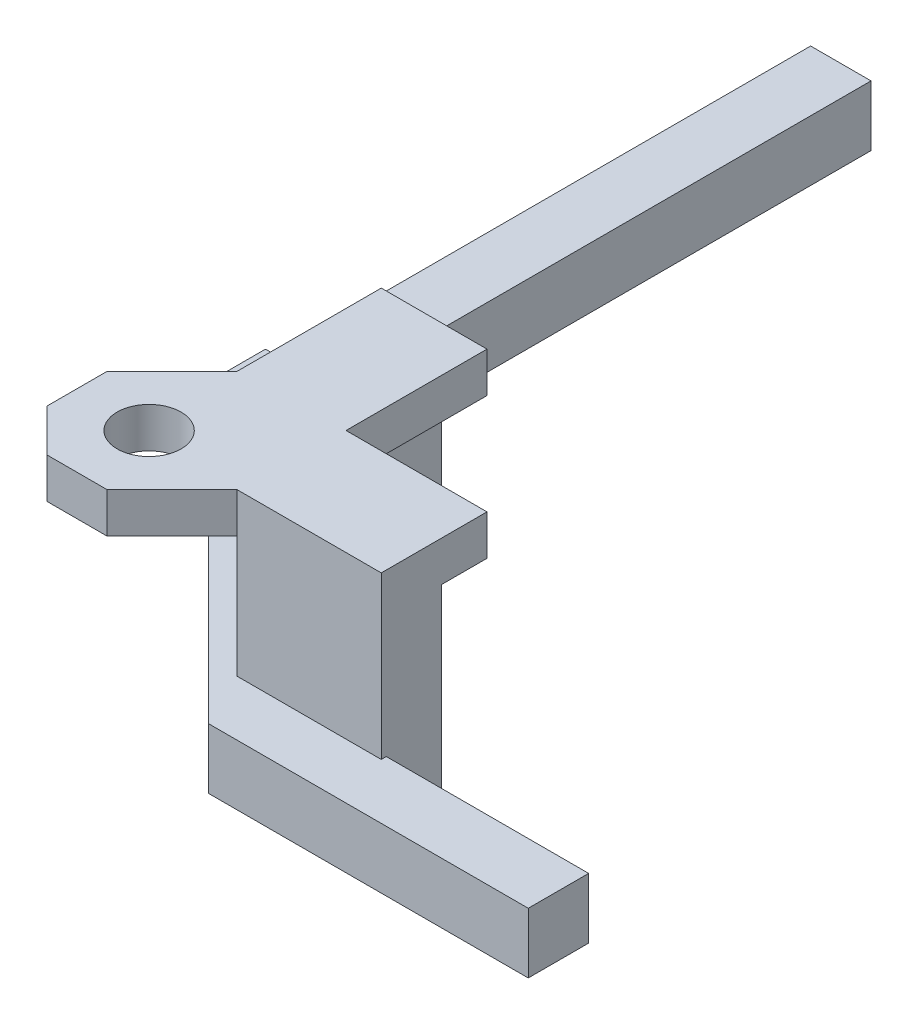
ISO-10303-21;
HEADER;
FILE_DESCRIPTION(('STEP AP214'),'2;1');
FILE_NAME('part.step','',(''),(''),'','','');
FILE_SCHEMA(('AUTOMOTIVE_DESIGN { 1 0 10303 214 1 1 1 1 }'));
ENDSEC;
DATA;
#1=APPLICATION_CONTEXT('core data for automotive mechanical design processes');
#2=APPLICATION_PROTOCOL_DEFINITION('international standard','automotive_design',2000,#1);
#3=PRODUCT_CONTEXT('',#1,'mechanical');
#4=PRODUCT('Part','Part','',(#3));
#5=PRODUCT_RELATED_PRODUCT_CATEGORY('part','',(#4));
#6=PRODUCT_DEFINITION_FORMATION('','',#4);
#7=PRODUCT_DEFINITION_CONTEXT('part definition',#1,'design');
#8=PRODUCT_DEFINITION('design','',#6,#7);
#9=PRODUCT_DEFINITION_SHAPE('','',#8);
#10=(LENGTH_UNIT() NAMED_UNIT(*) SI_UNIT(.MILLI.,.METRE.));
#11=(NAMED_UNIT(*) PLANE_ANGLE_UNIT() SI_UNIT($,.RADIAN.));
#12=(NAMED_UNIT(*) SI_UNIT($,.STERADIAN.) SOLID_ANGLE_UNIT());
#13=UNCERTAINTY_MEASURE_WITH_UNIT(LENGTH_MEASURE(1.E-05),#10,'distance_accuracy_value','');
#14=(GEOMETRIC_REPRESENTATION_CONTEXT(3) GLOBAL_UNCERTAINTY_ASSIGNED_CONTEXT((#13)) GLOBAL_UNIT_ASSIGNED_CONTEXT((#10,
#11,#12)) REPRESENTATION_CONTEXT('',''));
#15=CARTESIAN_POINT('',(0.,0.,0.));
#16=DIRECTION('',(0.,0.,1.));
#17=DIRECTION('',(1.,0.,0.));
#18=AXIS2_PLACEMENT_3D('',#15,#16,#17);
#19=CARTESIAN_POINT('',(-31.9431457505076,6.,76.7));
#20=DIRECTION('',(0.,0.,1.));
#21=DIRECTION('',(1.,0.,0.));
#22=AXIS2_PLACEMENT_3D('',#19,#20,#21);
#23=PLANE('',#22);
#24=DIRECTION('',(-1.,0.,0.));
#25=VECTOR('',#24,1.);
#26=CARTESIAN_POINT('',(13.9652135623731,10.05,76.7));
#27=LINE('',#26,#25);
#28=CARTESIAN_POINT('',(-28.4284271247462,10.05,76.7));
#29=VERTEX_POINT('',#28);
#30=CARTESIAN_POINT('',(-31.9431457505076,10.05,76.7));
#31=VERTEX_POINT('',#30);
#32=EDGE_CURVE('E282',#29,#31,#27,.T.);
#33=ORIENTED_EDGE('',*,*,#32,.F.);
#34=DIRECTION('',(0.,-1.,0.));
#35=VECTOR('',#34,1.);
#36=CARTESIAN_POINT('',(-28.4284271247462,18.05,76.7));
#37=LINE('',#36,#35);
#38=CARTESIAN_POINT('',(-28.4284271247462,18.05,76.7));
#39=VERTEX_POINT('',#38);
#40=EDGE_CURVE('E272',#39,#29,#37,.T.);
#41=ORIENTED_EDGE('',*,*,#40,.F.);
#42=DIRECTION('',(-1.,0.,0.));
#43=VECTOR('',#42,1.);
#44=CARTESIAN_POINT('',(-31.9431457505076,18.05,76.7));
#45=LINE('',#44,#43);
#46=CARTESIAN_POINT('',(-20.1,18.05,76.7));
#47=VERTEX_POINT('',#46);
#48=EDGE_CURVE('E373',#47,#39,#45,.T.);
#49=ORIENTED_EDGE('',*,*,#48,.F.);
#50=DIRECTION('',(0.,-1.,0.));
#51=VECTOR('',#50,1.);
#52=CARTESIAN_POINT('',(-20.1,6.,76.7));
#53=LINE('',#52,#51);
#54=CARTESIAN_POINT('',(-20.1,0.,76.7));
#55=VERTEX_POINT('',#54);
#56=EDGE_CURVE('E489',#47,#55,#53,.T.);
#57=ORIENTED_EDGE('',*,*,#56,.T.);
#58=DIRECTION('',(-1.,0.,0.));
#59=VECTOR('',#58,1.);
#60=CARTESIAN_POINT('',(-31.9431457505076,0.,76.7));
#61=LINE('',#60,#59);
#62=CARTESIAN_POINT('',(-31.9431457505076,0.,76.7));
#63=VERTEX_POINT('',#62);
#64=EDGE_CURVE('E465',#55,#63,#61,.T.);
#65=ORIENTED_EDGE('',*,*,#64,.T.);
#66=DIRECTION('',(0.,-1.,0.));
#67=VECTOR('',#66,1.);
#68=CARTESIAN_POINT('',(-31.9431457505076,6.,76.7));
#69=LINE('',#68,#67);
#70=EDGE_CURVE('E487',#31,#63,#69,.T.);
#71=ORIENTED_EDGE('',*,*,#70,.F.);
#72=EDGE_LOOP('',(#33,#41,#49,#57,#65,#71));
#73=FACE_BOUND('',#72,.T.);
#74=ADVANCED_FACE('F36',(#73),#23,.F.);
#75=CARTESIAN_POINT('',(-38.6,6.,70.0431457505076));
#76=DIRECTION('',(-0.707106781186546,0.,0.707106781186549));
#77=DIRECTION('',(0.707106781186549,0.,0.707106781186546));
#78=AXIS2_PLACEMENT_3D('',#75,#76,#77);
#79=PLANE('',#78);
#80=DIRECTION('',(-0.707106781186549,0.,-0.707106781186546));
#81=VECTOR('',#80,1.);
#82=CARTESIAN_POINT('',(-40.3573593128806,10.05,68.285786437627));
#83=LINE('',#82,#81);
#84=CARTESIAN_POINT('',(-38.6,10.05,70.0431457505076));
#85=VERTEX_POINT('',#84);
#86=EDGE_CURVE('E269',#31,#85,#83,.T.);
#87=ORIENTED_EDGE('',*,*,#86,.F.);
#88=ORIENTED_EDGE('',*,*,#70,.T.);
#89=DIRECTION('',(-0.707106781186548,0.,-0.707106781186546));
#90=VECTOR('',#89,1.);
#91=CARTESIAN_POINT('',(-38.6,0.,70.0431457505076));
#92=LINE('',#91,#90);
#93=CARTESIAN_POINT('',(-38.6,0.,70.0431457505076));
#94=VERTEX_POINT('',#93);
#95=EDGE_CURVE('E468',#63,#94,#92,.T.);
#96=ORIENTED_EDGE('',*,*,#95,.T.);
#97=DIRECTION('',(0.,-1.,0.));
#98=VECTOR('',#97,1.);
#99=CARTESIAN_POINT('',(-38.6,6.,70.0431457505076));
#100=LINE('',#99,#98);
#101=EDGE_CURVE('E485',#85,#94,#100,.T.);
#102=ORIENTED_EDGE('',*,*,#101,.F.);
#103=EDGE_LOOP('',(#87,#88,#96,#102));
#104=FACE_BOUND('',#103,.T.);
#105=ADVANCED_FACE('F609',(#104),#79,.F.);
#106=CARTESIAN_POINT('',(-38.6,6.,58.2));
#107=DIRECTION('',(-1.,0.,0.));
#108=DIRECTION('',(0.,0.,1.));
#109=AXIS2_PLACEMENT_3D('',#106,#107,#108);
#110=PLANE('',#109);
#111=DIRECTION('',(0.,1.,0.));
#112=VECTOR('',#111,1.);
#113=CARTESIAN_POINT('',(-38.6,18.05,66.5284271247462));
#114=LINE('',#113,#112);
#115=CARTESIAN_POINT('',(-38.6,10.05,66.5284271247462));
#116=VERTEX_POINT('',#115);
#117=CARTESIAN_POINT('',(-38.6,18.05,66.5284271247462));
#118=VERTEX_POINT('',#117);
#119=EDGE_CURVE('E61',#116,#118,#114,.T.);
#120=ORIENTED_EDGE('',*,*,#119,.F.);
#121=DIRECTION('',(0.,0.,-1.));
#122=VECTOR('',#121,1.);
#123=CARTESIAN_POINT('',(-38.6,10.05,13.9632135623731));
#124=LINE('',#123,#122);
#125=EDGE_CURVE('E266',#85,#116,#124,.T.);
#126=ORIENTED_EDGE('',*,*,#125,.F.);
#127=ORIENTED_EDGE('',*,*,#101,.T.);
#128=DIRECTION('',(0.,0.,-1.));
#129=VECTOR('',#128,1.);
#130=CARTESIAN_POINT('',(-38.6,0.,58.2));
#131=LINE('',#130,#129);
#132=CARTESIAN_POINT('',(-38.6,0.,58.2));
#133=VERTEX_POINT('',#132);
#134=EDGE_CURVE('E471',#94,#133,#131,.T.);
#135=ORIENTED_EDGE('',*,*,#134,.T.);
#136=DIRECTION('',(0.,-1.,0.));
#137=VECTOR('',#136,1.);
#138=CARTESIAN_POINT('',(-38.6,6.,58.2));
#139=LINE('',#138,#137);
#140=CARTESIAN_POINT('',(-38.6,18.05,58.2));
#141=VERTEX_POINT('',#140);
#142=EDGE_CURVE('E482',#141,#133,#139,.T.);
#143=ORIENTED_EDGE('',*,*,#142,.F.);
#144=DIRECTION('',(0.,0.,-1.));
#145=VECTOR('',#144,1.);
#146=CARTESIAN_POINT('',(-38.6,18.05,58.2));
#147=LINE('',#146,#145);
#148=EDGE_CURVE('E277',#118,#141,#147,.T.);
#149=ORIENTED_EDGE('',*,*,#148,.F.);
#150=EDGE_LOOP('',(#120,#126,#127,#135,#143,#149));
#151=FACE_BOUND('',#150,.T.);
#152=ADVANCED_FACE('F275',(#151),#110,.F.);
#153=CARTESIAN_POINT('',(-44.6,18.05,72.5284271247462));
#154=DIRECTION('',(0.707106781186548,0.,-0.707106781186548));
#155=DIRECTION('',(-0.707106781186548,0.,-0.707106781186548));
#156=AXIS2_PLACEMENT_3D('',#153,#154,#155);
#157=PLANE('',#156);
#158=DIRECTION('',(0.707106781186548,0.,0.707106781186548));
#159=VECTOR('',#158,1.);
#160=CARTESIAN_POINT('',(-44.6,10.05,72.5284271247462));
#161=LINE('',#160,#159);
#162=CARTESIAN_POINT('',(-44.6,10.05,72.5284271247462));
#163=VERTEX_POINT('',#162);
#164=CARTESIAN_POINT('',(-34.4284271247462,10.05,82.7));
#165=VERTEX_POINT('',#164);
#166=EDGE_CURVE('E263',#163,#165,#161,.T.);
#167=ORIENTED_EDGE('',*,*,#166,.F.);
#168=DIRECTION('',(0.,-1.,0.));
#169=VECTOR('',#168,1.);
#170=CARTESIAN_POINT('',(-44.6,18.05,72.5284271247462));
#171=LINE('',#170,#169);
#172=CARTESIAN_POINT('',(-44.6,6.,72.5284271247462));
#173=VERTEX_POINT('',#172);
#174=EDGE_CURVE('E395',#163,#173,#171,.T.);
#175=ORIENTED_EDGE('',*,*,#174,.T.);
#176=DIRECTION('',(0.707106781186548,0.,0.707106781186548));
#177=VECTOR('',#176,1.);
#178=CARTESIAN_POINT('',(-44.6,6.,72.5284271247462));
#179=LINE('',#178,#177);
#180=CARTESIAN_POINT('',(-34.4284271247462,6.,82.7));
#181=VERTEX_POINT('',#180);
#182=EDGE_CURVE('E381',#173,#181,#179,.T.);
#183=ORIENTED_EDGE('',*,*,#182,.T.);
#184=DIRECTION('',(0.,-1.,0.));
#185=VECTOR('',#184,1.);
#186=CARTESIAN_POINT('',(-34.4284271247462,18.05,82.7));
#187=LINE('',#186,#185);
#188=EDGE_CURVE('E391',#165,#181,#187,.T.);
#189=ORIENTED_EDGE('',*,*,#188,.F.);
#190=EDGE_LOOP('',(#167,#175,#183,#189));
#191=FACE_BOUND('',#190,.T.);
#192=ADVANCED_FACE('F657',(#191),#157,.F.);
#193=CARTESIAN_POINT('',(0.,0.,0.));
#194=DIRECTION('',(0.,1.,0.));
#195=DIRECTION('',(0.,0.,1.));
#196=AXIS2_PLACEMENT_3D('',#193,#194,#195);
#197=PLANE('',#196);
#198=DIRECTION('',(-1.,0.,0.));
#199=VECTOR('',#198,1.);
#200=CARTESIAN_POINT('',(-61.15,0.,61.15));
#201=LINE('',#200,#199);
#202=CARTESIAN_POINT('',(-53.15,0.,61.15));
#203=VERTEX_POINT('',#202);
#204=CARTESIAN_POINT('',(-58.8068542494923,0.,61.15));
#205=VERTEX_POINT('',#204);
#206=EDGE_CURVE('E400',#203,#205,#201,.T.);
#207=ORIENTED_EDGE('',*,*,#206,.F.);
#208=DIRECTION('',(0.,0.,1.));
#209=VECTOR('',#208,1.);
#210=CARTESIAN_POINT('',(-53.15,0.,58.2));
#211=LINE('',#210,#209);
#212=CARTESIAN_POINT('',(-53.15,0.,58.2));
#213=VERTEX_POINT('',#212);
#214=EDGE_CURVE('E11',#213,#203,#211,.T.);
#215=ORIENTED_EDGE('',*,*,#214,.F.);
#216=DIRECTION('',(-1.,0.,0.));
#217=VECTOR('',#216,1.);
#218=CARTESIAN_POINT('',(-53.15,0.,58.2));
#219=LINE('',#218,#217);
#220=EDGE_CURVE('E423',#133,#213,#219,.T.);
#221=ORIENTED_EDGE('',*,*,#220,.F.);
#222=ORIENTED_EDGE('',*,*,#134,.F.);
#223=ORIENTED_EDGE('',*,*,#95,.F.);
#224=ORIENTED_EDGE('',*,*,#64,.F.);
#225=DIRECTION('',(0.,0.,-1.));
#226=VECTOR('',#225,1.);
#227=CARTESIAN_POINT('',(-20.1,0.,76.7));
#228=LINE('',#227,#226);
#229=CARTESIAN_POINT('',(-20.1,0.,82.2));
#230=VERTEX_POINT('',#229);
#231=EDGE_CURVE('E463',#230,#55,#228,.T.);
#232=ORIENTED_EDGE('',*,*,#231,.F.);
#233=DIRECTION('',(-1.,0.,0.));
#234=VECTOR('',#233,1.);
#235=CARTESIAN_POINT('',(0.,0.,82.2));
#236=LINE('',#235,#234);
#237=CARTESIAN_POINT('',(0.,0.,82.2));
#238=VERTEX_POINT('',#237);
#239=EDGE_CURVE('E461',#238,#230,#236,.T.);
#240=ORIENTED_EDGE('',*,*,#239,.F.);
#241=DIRECTION('',(0.,0.,-1.));
#242=VECTOR('',#241,1.);
#243=CARTESIAN_POINT('',(0.,0.,88.2));
#244=LINE('',#243,#242);
#245=CARTESIAN_POINT('',(0.,0.,88.2));
#246=VERTEX_POINT('',#245);
#247=EDGE_CURVE('E459',#246,#238,#244,.T.);
#248=ORIENTED_EDGE('',*,*,#247,.F.);
#249=DIRECTION('',(1.,0.,0.));
#250=VECTOR('',#249,1.);
#251=CARTESIAN_POINT('',(-31.7568542494924,0.,88.2));
#252=LINE('',#251,#250);
#253=CARTESIAN_POINT('',(-31.7568542494924,0.,88.2));
#254=VERTEX_POINT('',#253);
#255=EDGE_CURVE('E457',#254,#246,#252,.T.);
#256=ORIENTED_EDGE('',*,*,#255,.F.);
#257=DIRECTION('',(0.707106781186546,0.,0.707106781186549));
#258=VECTOR('',#257,1.);
#259=CARTESIAN_POINT('',(-58.8068542494923,0.,61.15));
#260=LINE('',#259,#258);
#261=EDGE_CURVE('E455',#205,#254,#260,.T.);
#262=ORIENTED_EDGE('',*,*,#261,.F.);
#263=EDGE_LOOP('',(#207,#215,#221,#222,#223,#224,#232,#240,#248,#256,#262));
#264=FACE_BOUND('',#263,.T.);
#265=ADVANCED_FACE('F619',(#264),#197,.F.);
#266=DIRECTION('',(1.,0.,0.));
#267=VECTOR('',#266,1.);
#268=CARTESIAN_POINT('',(-61.15,0.,53.15));
#269=LINE('',#268,#267);
#270=CARTESIAN_POINT('',(-60.15,0.,53.15));
#271=VERTEX_POINT('',#270);
#272=CARTESIAN_POINT('',(-54.15,0.,53.15));
#273=VERTEX_POINT('',#272);
#274=EDGE_CURVE('E45',#271,#273,#269,.T.);
#275=ORIENTED_EDGE('',*,*,#274,.F.);
#276=DIRECTION('',(0.,0.,1.));
#277=VECTOR('',#276,1.);
#278=CARTESIAN_POINT('',(-60.15,0.,0.));
#279=LINE('',#278,#277);
#280=CARTESIAN_POINT('',(-60.15,0.,0.));
#281=VERTEX_POINT('',#280);
#282=EDGE_CURVE('E452',#281,#271,#279,.T.);
#283=ORIENTED_EDGE('',*,*,#282,.F.);
#284=DIRECTION('',(-1.,0.,0.));
#285=VECTOR('',#284,1.);
#286=CARTESIAN_POINT('',(-54.15,0.,0.));
#287=LINE('',#286,#285);
#288=CARTESIAN_POINT('',(-54.15,0.,0.));
#289=VERTEX_POINT('',#288);
#290=EDGE_CURVE('E450',#289,#281,#287,.T.);
#291=ORIENTED_EDGE('',*,*,#290,.F.);
#292=DIRECTION('',(0.,0.,-1.));
#293=VECTOR('',#292,1.);
#294=CARTESIAN_POINT('',(-54.15,0.,0.));
#295=LINE('',#294,#293);
#296=EDGE_CURVE('E418',#273,#289,#295,.T.);
#297=ORIENTED_EDGE('',*,*,#296,.F.);
#298=EDGE_LOOP('',(#275,#283,#291,#297));
#299=FACE_BOUND('',#298,.T.);
#300=ADVANCED_FACE('F528',(#299),#197,.F.);
#301=CARTESIAN_POINT('',(-54.15,6.,0.));
#302=DIRECTION('',(-1.,0.,0.));
#303=DIRECTION('',(0.,0.,1.));
#304=AXIS2_PLACEMENT_3D('',#301,#302,#303);
#305=PLANE('',#304);
#306=ORIENTED_EDGE('',*,*,#296,.T.);
#307=DIRECTION('',(0.,-1.,0.));
#308=VECTOR('',#307,1.);
#309=CARTESIAN_POINT('',(-54.15,6.,0.));
#310=LINE('',#309,#308);
#311=CARTESIAN_POINT('',(-54.15,6.,0.));
#312=VERTEX_POINT('',#311);
#313=EDGE_CURVE('E40',#312,#289,#310,.T.);
#314=ORIENTED_EDGE('',*,*,#313,.F.);
#315=DIRECTION('',(0.,0.,-1.));
#316=VECTOR('',#315,1.);
#317=CARTESIAN_POINT('',(-54.15,6.,0.));
#318=LINE('',#317,#316);
#319=CARTESIAN_POINT('',(-54.15,6.,53.15));
#320=VERTEX_POINT('',#319);
#321=EDGE_CURVE('E419',#320,#312,#318,.T.);
#322=ORIENTED_EDGE('',*,*,#321,.F.);
#323=DIRECTION('',(0.,-1.,0.));
#324=VECTOR('',#323,1.);
#325=CARTESIAN_POINT('',(-54.15,6.,53.15));
#326=LINE('',#325,#324);
#327=EDGE_CURVE('E447',#320,#273,#326,.T.);
#328=ORIENTED_EDGE('',*,*,#327,.T.);
#329=EDGE_LOOP('',(#306,#314,#322,#328));
#330=FACE_BOUND('',#329,.T.);
#331=ADVANCED_FACE('F38',(#330),#305,.F.);
#332=CARTESIAN_POINT('',(-54.15,6.,0.));
#333=DIRECTION('',(0.,0.,1.));
#334=DIRECTION('',(1.,0.,0.));
#335=AXIS2_PLACEMENT_3D('',#332,#333,#334);
#336=PLANE('',#335);
#337=ORIENTED_EDGE('',*,*,#290,.T.);
#338=DIRECTION('',(0.,-1.,0.));
#339=VECTOR('',#338,1.);
#340=CARTESIAN_POINT('',(-60.15,6.,0.));
#341=LINE('',#340,#339);
#342=CARTESIAN_POINT('',(-60.15,6.,0.));
#343=VERTEX_POINT('',#342);
#344=EDGE_CURVE('E513',#343,#281,#341,.T.);
#345=ORIENTED_EDGE('',*,*,#344,.F.);
#346=DIRECTION('',(-1.,0.,0.));
#347=VECTOR('',#346,1.);
#348=CARTESIAN_POINT('',(-54.15,6.,0.));
#349=LINE('',#348,#347);
#350=EDGE_CURVE('E422',#312,#343,#349,.T.);
#351=ORIENTED_EDGE('',*,*,#350,.F.);
#352=ORIENTED_EDGE('',*,*,#313,.T.);
#353=EDGE_LOOP('',(#337,#345,#351,#352));
#354=FACE_BOUND('',#353,.T.);
#355=ADVANCED_FACE('F522',(#354),#336,.F.);
#356=CARTESIAN_POINT('',(-60.15,6.,0.));
#357=DIRECTION('',(1.,0.,0.));
#358=DIRECTION('',(0.,0.,-1.));
#359=AXIS2_PLACEMENT_3D('',#356,#357,#358);
#360=PLANE('',#359);
#361=ORIENTED_EDGE('',*,*,#282,.T.);
#362=DIRECTION('',(0.,-1.,0.));
#363=VECTOR('',#362,1.);
#364=CARTESIAN_POINT('',(-60.15,6.,53.15));
#365=LINE('',#364,#363);
#366=CARTESIAN_POINT('',(-60.15,6.,53.15));
#367=VERTEX_POINT('',#366);
#368=EDGE_CURVE('E511',#367,#271,#365,.T.);
#369=ORIENTED_EDGE('',*,*,#368,.F.);
#370=DIRECTION('',(0.,0.,1.));
#371=VECTOR('',#370,1.);
#372=CARTESIAN_POINT('',(-60.15,6.,0.));
#373=LINE('',#372,#371);
#374=EDGE_CURVE('E425',#343,#367,#373,.T.);
#375=ORIENTED_EDGE('',*,*,#374,.F.);
#376=ORIENTED_EDGE('',*,*,#344,.T.);
#377=EDGE_LOOP('',(#361,#369,#375,#376));
#378=FACE_BOUND('',#377,.T.);
#379=ADVANCED_FACE('F530',(#378),#360,.F.);
#380=CARTESIAN_POINT('',(-61.15,6.,53.15));
#381=DIRECTION('',(1.,0.,0.));
#382=DIRECTION('',(0.,0.,-1.));
#383=AXIS2_PLACEMENT_3D('',#380,#381,#382);
#384=PLANE('',#383);
#385=DIRECTION('',(0.,-1.,0.));
#386=VECTOR('',#385,1.);
#387=CARTESIAN_POINT('',(-61.15,6.,53.15));
#388=LINE('',#387,#386);
#389=CARTESIAN_POINT('',(-61.15,6.,53.15));
#390=VERTEX_POINT('',#389);
#391=CARTESIAN_POINT('',(-61.15,-1.,53.15));
#392=VERTEX_POINT('',#391);
#393=EDGE_CURVE('E509',#390,#392,#388,.T.);
#394=ORIENTED_EDGE('',*,*,#393,.T.);
#395=DIRECTION('',(0.,0.,-1.));
#396=VECTOR('',#395,1.);
#397=CARTESIAN_POINT('',(-61.15,-1.,53.15));
#398=LINE('',#397,#396);
#399=CARTESIAN_POINT('',(-61.15,-1.,61.15));
#400=VERTEX_POINT('',#399);
#401=EDGE_CURVE('E407',#400,#392,#398,.T.);
#402=ORIENTED_EDGE('',*,*,#401,.F.);
#403=DIRECTION('',(0.,-1.,0.));
#404=VECTOR('',#403,1.);
#405=CARTESIAN_POINT('',(-61.15,6.,61.15));
#406=LINE('',#405,#404);
#407=CARTESIAN_POINT('',(-61.15,6.,61.15));
#408=VERTEX_POINT('',#407);
#409=EDGE_CURVE('E507',#408,#400,#406,.T.);
#410=ORIENTED_EDGE('',*,*,#409,.F.);
#411=DIRECTION('',(0.,0.,1.));
#412=VECTOR('',#411,1.);
#413=CARTESIAN_POINT('',(-61.15,6.,53.15));
#414=LINE('',#413,#412);
#415=EDGE_CURVE('E429',#390,#408,#414,.T.);
#416=ORIENTED_EDGE('',*,*,#415,.F.);
#417=EDGE_LOOP('',(#394,#402,#410,#416));
#418=FACE_BOUND('',#417,.T.);
#419=ADVANCED_FACE('F551',(#418),#384,.F.);
#420=CARTESIAN_POINT('',(-61.15,6.,61.15));
#421=DIRECTION('',(0.,0.,-1.));
#422=DIRECTION('',(-1.,0.,0.));
#423=AXIS2_PLACEMENT_3D('',#420,#421,#422);
#424=PLANE('',#423);
#425=ORIENTED_EDGE('',*,*,#409,.T.);
#426=DIRECTION('',(-1.,0.,0.));
#427=VECTOR('',#426,1.);
#428=CARTESIAN_POINT('',(-61.15,-1.,61.15));
#429=LINE('',#428,#427);
#430=CARTESIAN_POINT('',(-53.15,-1.,61.15));
#431=VERTEX_POINT('',#430);
#432=EDGE_CURVE('E404',#431,#400,#429,.T.);
#433=ORIENTED_EDGE('',*,*,#432,.F.);
#434=DIRECTION('',(0.,1.,0.));
#435=VECTOR('',#434,1.);
#436=CARTESIAN_POINT('',(-53.15,-1.,61.15));
#437=LINE('',#436,#435);
#438=EDGE_CURVE('E413',#431,#203,#437,.T.);
#439=ORIENTED_EDGE('',*,*,#438,.T.);
#440=ORIENTED_EDGE('',*,*,#206,.T.);
#441=DIRECTION('',(0.,-1.,0.));
#442=VECTOR('',#441,1.);
#443=CARTESIAN_POINT('',(-58.8068542494923,6.,61.15));
#444=LINE('',#443,#442);
#445=CARTESIAN_POINT('',(-58.8068542494923,6.,61.15));
#446=VERTEX_POINT('',#445);
#447=EDGE_CURVE('E504',#446,#205,#444,.T.);
#448=ORIENTED_EDGE('',*,*,#447,.F.);
#449=DIRECTION('',(1.,0.,0.));
#450=VECTOR('',#449,1.);
#451=CARTESIAN_POINT('',(-61.15,6.,61.15));
#452=LINE('',#451,#450);
#453=EDGE_CURVE('E431',#408,#446,#452,.T.);
#454=ORIENTED_EDGE('',*,*,#453,.F.);
#455=EDGE_LOOP('',(#425,#433,#439,#440,#448,#454));
#456=FACE_BOUND('',#455,.T.);
#457=ADVANCED_FACE('F555',(#456),#424,.F.);
#458=CARTESIAN_POINT('',(-58.8068542494923,6.,61.15));
#459=DIRECTION('',(0.707106781186548,0.,-0.707106781186546));
#460=DIRECTION('',(-0.707106781186546,0.,-0.707106781186549));
#461=AXIS2_PLACEMENT_3D('',#458,#459,#460);
#462=PLANE('',#461);
#463=ORIENTED_EDGE('',*,*,#261,.T.);
#464=DIRECTION('',(0.,-1.,0.));
#465=VECTOR('',#464,1.);
#466=CARTESIAN_POINT('',(-31.7568542494924,6.,88.2));
#467=LINE('',#466,#465);
#468=CARTESIAN_POINT('',(-31.7568542494924,6.,88.2));
#469=VERTEX_POINT('',#468);
#470=EDGE_CURVE('E501',#469,#254,#467,.T.);
#471=ORIENTED_EDGE('',*,*,#470,.F.);
#472=DIRECTION('',(0.707106781186546,0.,0.707106781186549));
#473=VECTOR('',#472,1.);
#474=CARTESIAN_POINT('',(-58.8068542494923,6.,61.15));
#475=LINE('',#474,#473);
#476=EDGE_CURVE('E433',#446,#469,#475,.T.);
#477=ORIENTED_EDGE('',*,*,#476,.F.);
#478=ORIENTED_EDGE('',*,*,#447,.T.);
#479=EDGE_LOOP('',(#463,#471,#477,#478));
#480=FACE_BOUND('',#479,.T.);
#481=ADVANCED_FACE('F561',(#480),#462,.F.);
#482=CARTESIAN_POINT('',(-31.7568542494924,6.,88.2));
#483=DIRECTION('',(0.,0.,-1.));
#484=DIRECTION('',(-1.,0.,0.));
#485=AXIS2_PLACEMENT_3D('',#482,#483,#484);
#486=PLANE('',#485);
#487=ORIENTED_EDGE('',*,*,#255,.T.);
#488=DIRECTION('',(0.,-1.,0.));
#489=VECTOR('',#488,1.);
#490=CARTESIAN_POINT('',(0.,6.,88.2));
#491=LINE('',#490,#489);
#492=CARTESIAN_POINT('',(0.,6.,88.2));
#493=VERTEX_POINT('',#492);
#494=EDGE_CURVE('E498',#493,#246,#491,.T.);
#495=ORIENTED_EDGE('',*,*,#494,.F.);
#496=DIRECTION('',(1.,0.,0.));
#497=VECTOR('',#496,1.);
#498=CARTESIAN_POINT('',(-31.7568542494924,6.,88.2));
#499=LINE('',#498,#497);
#500=EDGE_CURVE('E435',#469,#493,#499,.T.);
#501=ORIENTED_EDGE('',*,*,#500,.F.);
#502=ORIENTED_EDGE('',*,*,#470,.T.);
#503=EDGE_LOOP('',(#487,#495,#501,#502));
#504=FACE_BOUND('',#503,.T.);
#505=ADVANCED_FACE('F565',(#504),#486,.F.);
#506=CARTESIAN_POINT('',(0.,6.,88.2));
#507=DIRECTION('',(-1.,0.,0.));
#508=DIRECTION('',(0.,0.,1.));
#509=AXIS2_PLACEMENT_3D('',#506,#507,#508);
#510=PLANE('',#509);
#511=ORIENTED_EDGE('',*,*,#247,.T.);
#512=DIRECTION('',(0.,-1.,0.));
#513=VECTOR('',#512,1.);
#514=CARTESIAN_POINT('',(0.,6.,82.2));
#515=LINE('',#514,#513);
#516=CARTESIAN_POINT('',(0.,6.,82.2));
#517=VERTEX_POINT('',#516);
#518=EDGE_CURVE('E495',#517,#238,#515,.T.);
#519=ORIENTED_EDGE('',*,*,#518,.F.);
#520=DIRECTION('',(0.,0.,-1.));
#521=VECTOR('',#520,1.);
#522=CARTESIAN_POINT('',(0.,6.,88.2));
#523=LINE('',#522,#521);
#524=EDGE_CURVE('E437',#493,#517,#523,.T.);
#525=ORIENTED_EDGE('',*,*,#524,.F.);
#526=ORIENTED_EDGE('',*,*,#494,.T.);
#527=EDGE_LOOP('',(#511,#519,#525,#526));
#528=FACE_BOUND('',#527,.T.);
#529=ADVANCED_FACE('F570',(#528),#510,.F.);
#530=CARTESIAN_POINT('',(0.,6.,82.2));
#531=DIRECTION('',(0.,0.,1.));
#532=DIRECTION('',(1.,0.,0.));
#533=AXIS2_PLACEMENT_3D('',#530,#531,#532);
#534=PLANE('',#533);
#535=ORIENTED_EDGE('',*,*,#239,.T.);
#536=DIRECTION('',(0.,-1.,0.));
#537=VECTOR('',#536,1.);
#538=CARTESIAN_POINT('',(-20.1,6.,82.2));
#539=LINE('',#538,#537);
#540=CARTESIAN_POINT('',(-20.1,6.,82.2));
#541=VERTEX_POINT('',#540);
#542=EDGE_CURVE('E492',#541,#230,#539,.T.);
#543=ORIENTED_EDGE('',*,*,#542,.F.);
#544=DIRECTION('',(-1.,0.,0.));
#545=VECTOR('',#544,1.);
#546=CARTESIAN_POINT('',(0.,6.,82.2));
#547=LINE('',#546,#545);
#548=EDGE_CURVE('E439',#517,#541,#547,.T.);
#549=ORIENTED_EDGE('',*,*,#548,.F.);
#550=ORIENTED_EDGE('',*,*,#518,.T.);
#551=EDGE_LOOP('',(#535,#543,#549,#550));
#552=FACE_BOUND('',#551,.T.);
#553=ADVANCED_FACE('F575',(#552),#534,.F.);
#554=CARTESIAN_POINT('',(-20.1,6.,76.7));
#555=DIRECTION('',(-1.,0.,0.));
#556=DIRECTION('',(0.,0.,1.));
#557=AXIS2_PLACEMENT_3D('',#554,#555,#556);
#558=PLANE('',#557);
#559=ORIENTED_EDGE('',*,*,#231,.T.);
#560=ORIENTED_EDGE('',*,*,#56,.F.);
#561=DIRECTION('',(0.,0.,-1.));
#562=VECTOR('',#561,1.);
#563=CARTESIAN_POINT('',(-20.1,18.05,72.2));
#564=LINE('',#563,#562);
#565=CARTESIAN_POINT('',(-20.1,18.05,72.2));
#566=VERTEX_POINT('',#565);
#567=EDGE_CURVE('E338',#47,#566,#564,.T.);
#568=ORIENTED_EDGE('',*,*,#567,.T.);
#569=DIRECTION('',(0.,-1.,0.));
#570=VECTOR('',#569,1.);
#571=CARTESIAN_POINT('',(-20.1,22.05,72.2));
#572=LINE('',#571,#570);
#573=CARTESIAN_POINT('',(-20.1,22.05,72.2));
#574=VERTEX_POINT('',#573);
#575=EDGE_CURVE('E351',#574,#566,#572,.T.);
#576=ORIENTED_EDGE('',*,*,#575,.F.);
#577=DIRECTION('',(0.,0.,-1.));
#578=VECTOR('',#577,1.);
#579=CARTESIAN_POINT('',(-20.1,22.05,72.2));
#580=LINE('',#579,#578);
#581=CARTESIAN_POINT('',(-20.1,22.05,82.7));
#582=VERTEX_POINT('',#581);
#583=EDGE_CURVE('E314',#582,#574,#580,.T.);
#584=ORIENTED_EDGE('',*,*,#583,.F.);
#585=DIRECTION('',(0.,-1.,0.));
#586=VECTOR('',#585,1.);
#587=CARTESIAN_POINT('',(-20.1,18.05,82.7));
#588=LINE('',#587,#586);
#589=CARTESIAN_POINT('',(-20.1,6.,82.7));
#590=VERTEX_POINT('',#589);
#591=EDGE_CURVE('E378',#582,#590,#588,.T.);
#592=ORIENTED_EDGE('',*,*,#591,.T.);
#593=DIRECTION('',(0.,0.,-1.));
#594=VECTOR('',#593,1.);
#595=CARTESIAN_POINT('',(-20.1,6.,82.7));
#596=LINE('',#595,#594);
#597=EDGE_CURVE('E376',#590,#541,#596,.T.);
#598=ORIENTED_EDGE('',*,*,#597,.T.);
#599=ORIENTED_EDGE('',*,*,#542,.T.);
#600=EDGE_LOOP('',(#559,#560,#568,#576,#584,#592,#598,#599));
#601=FACE_BOUND('',#600,.T.);
#602=ADVANCED_FACE('F579',(#601),#558,.F.);
#603=CARTESIAN_POINT('',(-53.15,6.,58.2));
#604=DIRECTION('',(0.,0.,1.));
#605=DIRECTION('',(1.,0.,0.));
#606=AXIS2_PLACEMENT_3D('',#603,#604,#605);
#607=PLANE('',#606);
#608=ORIENTED_EDGE('',*,*,#220,.T.);
#609=DIRECTION('',(0.,-1.,0.));
#610=VECTOR('',#609,1.);
#611=CARTESIAN_POINT('',(-53.15,6.,58.2));
#612=LINE('',#611,#610);
#613=CARTESIAN_POINT('',(-53.15,6.,58.2));
#614=VERTEX_POINT('',#613);
#615=EDGE_CURVE('E479',#614,#213,#612,.T.);
#616=ORIENTED_EDGE('',*,*,#615,.F.);
#617=DIRECTION('',(-1.,0.,0.));
#618=VECTOR('',#617,1.);
#619=CARTESIAN_POINT('',(-53.15,6.,58.2));
#620=LINE('',#619,#618);
#621=CARTESIAN_POINT('',(-44.6,6.,58.2));
#622=VERTEX_POINT('',#621);
#623=EDGE_CURVE('E441',#622,#614,#620,.T.);
#624=ORIENTED_EDGE('',*,*,#623,.F.);
#625=DIRECTION('',(0.,-1.,0.));
#626=VECTOR('',#625,1.);
#627=CARTESIAN_POINT('',(-44.6,18.05,58.2));
#628=LINE('',#627,#626);
#629=CARTESIAN_POINT('',(-44.6,22.05,58.2));
#630=VERTEX_POINT('',#629);
#631=EDGE_CURVE('E397',#630,#622,#628,.T.);
#632=ORIENTED_EDGE('',*,*,#631,.F.);
#633=DIRECTION('',(-1.,0.,0.));
#634=VECTOR('',#633,1.);
#635=CARTESIAN_POINT('',(-44.6,22.05,58.2));
#636=LINE('',#635,#634);
#637=CARTESIAN_POINT('',(-34.1,22.05,58.2));
#638=VERTEX_POINT('',#637);
#639=EDGE_CURVE('E320',#638,#630,#636,.T.);
#640=ORIENTED_EDGE('',*,*,#639,.F.);
#641=DIRECTION('',(0.,-1.,0.));
#642=VECTOR('',#641,1.);
#643=CARTESIAN_POINT('',(-34.1,22.05,58.2));
#644=LINE('',#643,#642);
#645=CARTESIAN_POINT('',(-34.1,18.05,58.2));
#646=VERTEX_POINT('',#645);
#647=EDGE_CURVE('E323',#638,#646,#644,.T.);
#648=ORIENTED_EDGE('',*,*,#647,.T.);
#649=DIRECTION('',(-1.,0.,0.));
#650=VECTOR('',#649,1.);
#651=CARTESIAN_POINT('',(-44.6,18.05,58.2));
#652=LINE('',#651,#650);
#653=EDGE_CURVE('E301',#646,#141,#652,.T.);
#654=ORIENTED_EDGE('',*,*,#653,.T.);
#655=ORIENTED_EDGE('',*,*,#142,.T.);
#656=EDGE_LOOP('',(#608,#616,#624,#632,#640,#648,#654,#655));
#657=FACE_BOUND('',#656,.T.);
#658=ADVANCED_FACE('F615',(#657),#607,.F.);
#659=CARTESIAN_POINT('',(-53.15,6.,53.1499999999999));
#660=DIRECTION('',(-1.,0.,0.));
#661=DIRECTION('',(0.,0.,1.));
#662=AXIS2_PLACEMENT_3D('',#659,#660,#661);
#663=PLANE('',#662);
#664=ORIENTED_EDGE('',*,*,#615,.T.);
#665=ORIENTED_EDGE('',*,*,#214,.T.);
#666=ORIENTED_EDGE('',*,*,#438,.F.);
#667=DIRECTION('',(0.,0.,1.));
#668=VECTOR('',#667,1.);
#669=CARTESIAN_POINT('',(-53.15,-1.,61.15));
#670=LINE('',#669,#668);
#671=CARTESIAN_POINT('',(-53.15,-1.,53.1499999999999));
#672=VERTEX_POINT('',#671);
#673=EDGE_CURVE('E401',#672,#431,#670,.T.);
#674=ORIENTED_EDGE('',*,*,#673,.F.);
#675=DIRECTION('',(0.,-1.,0.));
#676=VECTOR('',#675,1.);
#677=CARTESIAN_POINT('',(-53.15,6.,53.1499999999999));
#678=LINE('',#677,#676);
#679=CARTESIAN_POINT('',(-53.15,6.,53.1499999999999));
#680=VERTEX_POINT('',#679);
#681=EDGE_CURVE('E477',#680,#672,#678,.T.);
#682=ORIENTED_EDGE('',*,*,#681,.F.);
#683=DIRECTION('',(0.,0.,-1.));
#684=VECTOR('',#683,1.);
#685=CARTESIAN_POINT('',(-53.15,6.,53.1499999999999));
#686=LINE('',#685,#684);
#687=EDGE_CURVE('E443',#614,#680,#686,.T.);
#688=ORIENTED_EDGE('',*,*,#687,.F.);
#689=EDGE_LOOP('',(#664,#665,#666,#674,#682,#688));
#690=FACE_BOUND('',#689,.T.);
#691=ADVANCED_FACE('F546',(#690),#663,.F.);
#692=CARTESIAN_POINT('',(-54.15,6.,53.15));
#693=DIRECTION('',(0.,0.,1.));
#694=DIRECTION('',(1.,0.,0.));
#695=AXIS2_PLACEMENT_3D('',#692,#693,#694);
#696=PLANE('',#695);
#697=ORIENTED_EDGE('',*,*,#681,.T.);
#698=DIRECTION('',(1.,0.,0.));
#699=VECTOR('',#698,1.);
#700=CARTESIAN_POINT('',(-61.15,-1.,53.15));
#701=LINE('',#700,#699);
#702=EDGE_CURVE('E410',#392,#672,#701,.T.);
#703=ORIENTED_EDGE('',*,*,#702,.F.);
#704=ORIENTED_EDGE('',*,*,#393,.F.);
#705=DIRECTION('',(-1.,0.,0.));
#706=VECTOR('',#705,1.);
#707=CARTESIAN_POINT('',(-60.15,6.,53.15));
#708=LINE('',#707,#706);
#709=EDGE_CURVE('E427',#367,#390,#708,.T.);
#710=ORIENTED_EDGE('',*,*,#709,.F.);
#711=ORIENTED_EDGE('',*,*,#368,.T.);
#712=ORIENTED_EDGE('',*,*,#274,.T.);
#713=ORIENTED_EDGE('',*,*,#327,.F.);
#714=DIRECTION('',(-1.,0.,0.));
#715=VECTOR('',#714,1.);
#716=CARTESIAN_POINT('',(-54.15,6.,53.15));
#717=LINE('',#716,#715);
#718=EDGE_CURVE('E445',#680,#320,#717,.T.);
#719=ORIENTED_EDGE('',*,*,#718,.F.);
#720=EDGE_LOOP('',(#697,#703,#704,#710,#711,#712,#713,#719));
#721=FACE_BOUND('',#720,.T.);
#722=ADVANCED_FACE('F533',(#721),#696,.F.);
#723=CARTESIAN_POINT('',(0.,6.,0.));
#724=DIRECTION('',(0.,1.,0.));
#725=DIRECTION('',(0.,0.,1.));
#726=AXIS2_PLACEMENT_3D('',#723,#724,#725);
#727=PLANE('',#726);
#728=ORIENTED_EDGE('',*,*,#597,.F.);
#729=DIRECTION('',(1.,0.,0.));
#730=VECTOR('',#729,1.);
#731=CARTESIAN_POINT('',(-34.4284271247462,6.,82.7));
#732=LINE('',#731,#730);
#733=EDGE_CURVE('E384',#181,#590,#732,.T.);
#734=ORIENTED_EDGE('',*,*,#733,.F.);
#735=ORIENTED_EDGE('',*,*,#182,.F.);
#736=DIRECTION('',(0.,0.,1.));
#737=VECTOR('',#736,1.);
#738=CARTESIAN_POINT('',(-44.6,6.,58.2));
#739=LINE('',#738,#737);
#740=EDGE_CURVE('E372',#622,#173,#739,.T.);
#741=ORIENTED_EDGE('',*,*,#740,.F.);
#742=ORIENTED_EDGE('',*,*,#623,.T.);
#743=ORIENTED_EDGE('',*,*,#687,.T.);
#744=ORIENTED_EDGE('',*,*,#718,.T.);
#745=ORIENTED_EDGE('',*,*,#321,.T.);
#746=ORIENTED_EDGE('',*,*,#350,.T.);
#747=ORIENTED_EDGE('',*,*,#374,.T.);
#748=ORIENTED_EDGE('',*,*,#709,.T.);
#749=ORIENTED_EDGE('',*,*,#415,.T.);
#750=ORIENTED_EDGE('',*,*,#453,.T.);
#751=ORIENTED_EDGE('',*,*,#476,.T.);
#752=ORIENTED_EDGE('',*,*,#500,.T.);
#753=ORIENTED_EDGE('',*,*,#524,.T.);
#754=ORIENTED_EDGE('',*,*,#548,.T.);
#755=EDGE_LOOP('',(#728,#734,#735,#741,#742,#743,#744,#745,#746,#747,#748,#749,#750,#751,#752,
#753,#754));
#756=FACE_BOUND('',#755,.T.);
#757=ADVANCED_FACE('F538',(#756),#727,.T.);
#758=CARTESIAN_POINT('',(0.,-1.,0.));
#759=DIRECTION('',(0.,-1.,0.));
#760=DIRECTION('',(0.,0.,-1.));
#761=AXIS2_PLACEMENT_3D('',#758,#759,#760);
#762=PLANE('',#761);
#763=ORIENTED_EDGE('',*,*,#673,.T.);
#764=ORIENTED_EDGE('',*,*,#432,.T.);
#765=ORIENTED_EDGE('',*,*,#401,.T.);
#766=ORIENTED_EDGE('',*,*,#702,.T.);
#767=EDGE_LOOP('',(#763,#764,#765,#766));
#768=FACE_BOUND('',#767,.T.);
#769=ADVANCED_FACE('F548',(#768),#762,.T.);
#770=CARTESIAN_POINT('',(-44.6,18.05,58.2));
#771=DIRECTION('',(1.,0.,0.));
#772=DIRECTION('',(0.,0.,-1.));
#773=AXIS2_PLACEMENT_3D('',#770,#771,#772);
#774=PLANE('',#773);
#775=ORIENTED_EDGE('',*,*,#740,.T.);
#776=ORIENTED_EDGE('',*,*,#174,.F.);
#777=CARTESIAN_POINT('',(-44.6,18.05,72.5284271247462));
#778=VERTEX_POINT('',#777);
#779=EDGE_CURVE('E260',#778,#163,#171,.T.);
#780=ORIENTED_EDGE('',*,*,#779,.F.);
#781=DIRECTION('',(0.,0.,1.));
#782=VECTOR('',#781,1.);
#783=CARTESIAN_POINT('',(-44.6,18.05,72.5530176899731));
#784=LINE('',#783,#782);
#785=CARTESIAN_POINT('',(-44.6,18.05,72.5530176899731));
#786=VERTEX_POINT('',#785);
#787=EDGE_CURVE('E294',#778,#786,#784,.T.);
#788=ORIENTED_EDGE('',*,*,#787,.T.);
#789=DIRECTION('',(0.,-1.,0.));
#790=VECTOR('',#789,1.);
#791=CARTESIAN_POINT('',(-44.6,22.05,72.5530176899731));
#792=LINE('',#791,#790);
#793=CARTESIAN_POINT('',(-44.6,22.05,72.5530176899731));
#794=VERTEX_POINT('',#793);
#795=EDGE_CURVE('E369',#794,#786,#792,.T.);
#796=ORIENTED_EDGE('',*,*,#795,.F.);
#797=DIRECTION('',(0.,0.,1.));
#798=VECTOR('',#797,1.);
#799=CARTESIAN_POINT('',(-44.6,22.05,72.5530176899731));
#800=LINE('',#799,#798);
#801=EDGE_CURVE('E297',#630,#794,#800,.T.);
#802=ORIENTED_EDGE('',*,*,#801,.F.);
#803=ORIENTED_EDGE('',*,*,#631,.T.);
#804=EDGE_LOOP('',(#775,#776,#780,#788,#796,#802,#803));
#805=FACE_BOUND('',#804,.T.);
#806=ADVANCED_FACE('F636',(#805),#774,.F.);
#807=CARTESIAN_POINT('',(-34.4284271247462,18.05,82.7));
#808=DIRECTION('',(0.,0.,-1.));
#809=DIRECTION('',(-1.,0.,0.));
#810=AXIS2_PLACEMENT_3D('',#807,#808,#809);
#811=PLANE('',#810);
#812=ORIENTED_EDGE('',*,*,#733,.T.);
#813=ORIENTED_EDGE('',*,*,#591,.F.);
#814=DIRECTION('',(1.,0.,0.));
#815=VECTOR('',#814,1.);
#816=CARTESIAN_POINT('',(-20.1,22.05,82.7));
#817=LINE('',#816,#815);
#818=CARTESIAN_POINT('',(-34.4530176899731,22.05,82.7));
#819=VERTEX_POINT('',#818);
#820=EDGE_CURVE('E311',#819,#582,#817,.T.);
#821=ORIENTED_EDGE('',*,*,#820,.F.);
#822=DIRECTION('',(0.,-1.,0.));
#823=VECTOR('',#822,1.);
#824=CARTESIAN_POINT('',(-34.4530176899731,22.05,82.7));
#825=LINE('',#824,#823);
#826=CARTESIAN_POINT('',(-34.4530176899731,18.05,82.7));
#827=VERTEX_POINT('',#826);
#828=EDGE_CURVE('E354',#819,#827,#825,.T.);
#829=ORIENTED_EDGE('',*,*,#828,.T.);
#830=DIRECTION('',(1.,0.,0.));
#831=VECTOR('',#830,1.);
#832=CARTESIAN_POINT('',(-20.1,18.05,82.7));
#833=LINE('',#832,#831);
#834=CARTESIAN_POINT('',(-34.4284271247462,18.05,82.7));
#835=VERTEX_POINT('',#834);
#836=EDGE_CURVE('E335',#827,#835,#833,.T.);
#837=ORIENTED_EDGE('',*,*,#836,.T.);
#838=EDGE_CURVE('E392',#835,#165,#187,.T.);
#839=ORIENTED_EDGE('',*,*,#838,.T.);
#840=ORIENTED_EDGE('',*,*,#188,.T.);
#841=EDGE_LOOP('',(#812,#813,#821,#829,#837,#839,#840));
#842=FACE_BOUND('',#841,.T.);
#843=ADVANCED_FACE('F584',(#842),#811,.F.);
#844=CARTESIAN_POINT('',(0.,18.05,0.));
#845=DIRECTION('',(0.,-1.,0.));
#846=DIRECTION('',(0.,0.,-1.));
#847=AXIS2_PLACEMENT_3D('',#844,#845,#846);
#848=PLANE('',#847);
#849=ORIENTED_EDGE('',*,*,#567,.F.);
#850=ORIENTED_EDGE('',*,*,#48,.T.);
#851=DIRECTION('',(0.707106781186548,0.,-0.707106781186547));
#852=VECTOR('',#851,1.);
#853=CARTESIAN_POINT('',(-51.0170125304731,18.05,99.2885854057269));
#854=LINE('',#853,#852);
#855=EDGE_CURVE('E286',#835,#39,#854,.T.);
#856=ORIENTED_EDGE('',*,*,#855,.F.);
#857=ORIENTED_EDGE('',*,*,#836,.F.);
#858=DIRECTION('',(0.707106781186546,0.,-0.707106781186549));
#859=VECTOR('',#858,1.);
#860=CARTESIAN_POINT('',(-34.4530176899731,18.05,82.7));
#861=LINE('',#860,#859);
#862=CARTESIAN_POINT('',(-40.9086156261731,18.05,89.1555979362));
#863=VERTEX_POINT('',#862);
#864=EDGE_CURVE('E333',#863,#827,#861,.T.);
#865=ORIENTED_EDGE('',*,*,#864,.F.);
#866=DIRECTION('',(1.,0.,0.));
#867=VECTOR('',#866,1.);
#868=CARTESIAN_POINT('',(-40.9086156261731,18.05,89.1555979362));
#869=LINE('',#868,#867);
#870=CARTESIAN_POINT('',(-46.852580246227,18.05,89.1555979362));
#871=VERTEX_POINT('',#870);
#872=EDGE_CURVE('E331',#871,#863,#869,.T.);
#873=ORIENTED_EDGE('',*,*,#872,.F.);
#874=DIRECTION('',(0.707106781186547,0.,0.707106781186548));
#875=VECTOR('',#874,1.);
#876=CARTESIAN_POINT('',(-46.852580246227,18.05,89.1555979362));
#877=LINE('',#876,#875);
#878=CARTESIAN_POINT('',(-51.0555979362,18.05,84.952580246227));
#879=VERTEX_POINT('',#878);
#880=EDGE_CURVE('E329',#879,#871,#877,.T.);
#881=ORIENTED_EDGE('',*,*,#880,.F.);
#882=DIRECTION('',(0.,0.,1.));
#883=VECTOR('',#882,1.);
#884=CARTESIAN_POINT('',(-51.0555979362,18.05,84.952580246227));
#885=LINE('',#884,#883);
#886=CARTESIAN_POINT('',(-51.0555979362,18.05,79.0086156261731));
#887=VERTEX_POINT('',#886);
#888=EDGE_CURVE('E327',#887,#879,#885,.T.);
#889=ORIENTED_EDGE('',*,*,#888,.F.);
#890=DIRECTION('',(-0.707106781186552,0.,0.707106781186543));
#891=VECTOR('',#890,1.);
#892=CARTESIAN_POINT('',(-51.0555979362,18.05,79.0086156261731));
#893=LINE('',#892,#891);
#894=EDGE_CURVE('E325',#786,#887,#893,.T.);
#895=ORIENTED_EDGE('',*,*,#894,.F.);
#896=ORIENTED_EDGE('',*,*,#787,.F.);
#897=DIRECTION('',(0.707106781186548,0.,-0.707106781186547));
#898=VECTOR('',#897,1.);
#899=CARTESIAN_POINT('',(-61.1885854057269,18.05,89.1170125304731));
#900=LINE('',#899,#898);
#901=EDGE_CURVE('E284',#778,#118,#900,.T.);
#902=ORIENTED_EDGE('',*,*,#901,.T.);
#903=ORIENTED_EDGE('',*,*,#148,.T.);
#904=ORIENTED_EDGE('',*,*,#653,.F.);
#905=DIRECTION('',(0.,0.,-1.));
#906=VECTOR('',#905,1.);
#907=CARTESIAN_POINT('',(-34.1,18.05,58.2));
#908=LINE('',#907,#906);
#909=CARTESIAN_POINT('',(-34.1,18.05,72.2));
#910=VERTEX_POINT('',#909);
#911=EDGE_CURVE('E342',#910,#646,#908,.T.);
#912=ORIENTED_EDGE('',*,*,#911,.F.);
#913=DIRECTION('',(-1.,0.,0.));
#914=VECTOR('',#913,1.);
#915=CARTESIAN_POINT('',(-34.1,18.05,72.2));
#916=LINE('',#915,#914);
#917=EDGE_CURVE('E340',#566,#910,#916,.T.);
#918=ORIENTED_EDGE('',*,*,#917,.F.);
#919=EDGE_LOOP('',(#849,#850,#856,#857,#865,#873,#881,#889,#895,#896,#902,#903,#904,#912,#918));
#920=FACE_BOUND('',#919,.T.);
#921=CARTESIAN_POINT('',(-43.8805979362,18.05,81.9805979362));
#922=DIRECTION('',(0.,1.,0.));
#923=DIRECTION('',(0.,0.,1.));
#924=AXIS2_PLACEMENT_3D('',#921,#922,#923);
#925=CIRCLE('',#924,3.175);
#926=CARTESIAN_POINT('',(-43.8805979362,18.05,85.1555979362));
#927=VERTEX_POINT('',#926);
#928=EDGE_CURVE('E290',#927,#927,#925,.T.);
#929=ORIENTED_EDGE('',*,*,#928,.T.);
#930=EDGE_LOOP('',(#929));
#931=FACE_BOUND('',#930,.T.);
#932=ADVANCED_FACE('F599',(#920,#931),#848,.T.);
#933=CARTESIAN_POINT('',(0.,22.05,0.));
#934=DIRECTION('',(0.,-1.,0.));
#935=DIRECTION('',(0.,0.,-1.));
#936=AXIS2_PLACEMENT_3D('',#933,#934,#935);
#937=PLANE('',#936);
#938=ORIENTED_EDGE('',*,*,#801,.T.);
#939=DIRECTION('',(-0.707106781186552,0.,0.707106781186543));
#940=VECTOR('',#939,1.);
#941=CARTESIAN_POINT('',(-51.0555979362,22.05,79.0086156261731));
#942=LINE('',#941,#940);
#943=CARTESIAN_POINT('',(-51.0555979362,22.05,79.0086156261731));
#944=VERTEX_POINT('',#943);
#945=EDGE_CURVE('E300',#794,#944,#942,.T.);
#946=ORIENTED_EDGE('',*,*,#945,.T.);
#947=DIRECTION('',(0.,0.,1.));
#948=VECTOR('',#947,1.);
#949=CARTESIAN_POINT('',(-51.0555979362,22.05,84.952580246227));
#950=LINE('',#949,#948);
#951=CARTESIAN_POINT('',(-51.0555979362,22.05,84.952580246227));
#952=VERTEX_POINT('',#951);
#953=EDGE_CURVE('E303',#944,#952,#950,.T.);
#954=ORIENTED_EDGE('',*,*,#953,.T.);
#955=DIRECTION('',(0.707106781186547,0.,0.707106781186548));
#956=VECTOR('',#955,1.);
#957=CARTESIAN_POINT('',(-46.852580246227,22.05,89.1555979362));
#958=LINE('',#957,#956);
#959=CARTESIAN_POINT('',(-46.852580246227,22.05,89.1555979362));
#960=VERTEX_POINT('',#959);
#961=EDGE_CURVE('E305',#952,#960,#958,.T.);
#962=ORIENTED_EDGE('',*,*,#961,.T.);
#963=DIRECTION('',(1.,0.,0.));
#964=VECTOR('',#963,1.);
#965=CARTESIAN_POINT('',(-40.9086156261731,22.05,89.1555979362));
#966=LINE('',#965,#964);
#967=CARTESIAN_POINT('',(-40.9086156261731,22.05,89.1555979362));
#968=VERTEX_POINT('',#967);
#969=EDGE_CURVE('E307',#960,#968,#966,.T.);
#970=ORIENTED_EDGE('',*,*,#969,.T.);
#971=DIRECTION('',(0.707106781186546,0.,-0.707106781186549));
#972=VECTOR('',#971,1.);
#973=CARTESIAN_POINT('',(-34.4530176899731,22.05,82.7));
#974=LINE('',#973,#972);
#975=EDGE_CURVE('E309',#968,#819,#974,.T.);
#976=ORIENTED_EDGE('',*,*,#975,.T.);
#977=ORIENTED_EDGE('',*,*,#820,.T.);
#978=ORIENTED_EDGE('',*,*,#583,.T.);
#979=DIRECTION('',(-1.,0.,0.));
#980=VECTOR('',#979,1.);
#981=CARTESIAN_POINT('',(-34.1,22.05,72.2));
#982=LINE('',#981,#980);
#983=CARTESIAN_POINT('',(-34.1,22.05,72.2));
#984=VERTEX_POINT('',#983);
#985=EDGE_CURVE('E316',#574,#984,#982,.T.);
#986=ORIENTED_EDGE('',*,*,#985,.T.);
#987=DIRECTION('',(0.,0.,-1.));
#988=VECTOR('',#987,1.);
#989=CARTESIAN_POINT('',(-34.1,22.05,58.2));
#990=LINE('',#989,#988);
#991=EDGE_CURVE('E318',#984,#638,#990,.T.);
#992=ORIENTED_EDGE('',*,*,#991,.T.);
#993=ORIENTED_EDGE('',*,*,#639,.T.);
#994=EDGE_LOOP('',(#938,#946,#954,#962,#970,#976,#977,#978,#986,#992,#993));
#995=FACE_BOUND('',#994,.T.);
#996=CARTESIAN_POINT('',(-43.8805979362,22.05,81.9805979362));
#997=DIRECTION('',(0.,1.,0.));
#998=DIRECTION('',(0.,0.,1.));
#999=AXIS2_PLACEMENT_3D('',#996,#997,#998);
#1000=CIRCLE('',#999,3.175);
#1001=CARTESIAN_POINT('',(-43.8805979362,22.05,85.1555979362));
#1002=VERTEX_POINT('',#1001);
#1003=EDGE_CURVE('E291',#1002,#1002,#1000,.T.);
#1004=ORIENTED_EDGE('',*,*,#1003,.F.);
#1005=EDGE_LOOP('',(#1004));
#1006=FACE_BOUND('',#1005,.T.);
#1007=ADVANCED_FACE('F586',(#995,#1006),#937,.F.);
#1008=CARTESIAN_POINT('',(-51.0555979362,22.05,79.0086156261731));
#1009=DIRECTION('',(0.707106781186543,0.,0.707106781186552));
#1010=DIRECTION('',(0.707106781186552,0.,-0.707106781186543));
#1011=AXIS2_PLACEMENT_3D('',#1008,#1009,#1010);
#1012=PLANE('',#1011);
#1013=ORIENTED_EDGE('',*,*,#894,.T.);
#1014=DIRECTION('',(0.,-1.,0.));
#1015=VECTOR('',#1014,1.);
#1016=CARTESIAN_POINT('',(-51.0555979362,22.05,79.0086156261731));
#1017=LINE('',#1016,#1015);
#1018=EDGE_CURVE('E366',#944,#887,#1017,.T.);
#1019=ORIENTED_EDGE('',*,*,#1018,.F.);
#1020=ORIENTED_EDGE('',*,*,#945,.F.);
#1021=ORIENTED_EDGE('',*,*,#795,.T.);
#1022=EDGE_LOOP('',(#1013,#1019,#1020,#1021));
#1023=FACE_BOUND('',#1022,.T.);
#1024=ADVANCED_FACE('F640',(#1023),#1012,.F.);
#1025=CARTESIAN_POINT('',(-51.0555979362,22.05,84.952580246227));
#1026=DIRECTION('',(1.,0.,0.));
#1027=DIRECTION('',(0.,0.,-1.));
#1028=AXIS2_PLACEMENT_3D('',#1025,#1026,#1027);
#1029=PLANE('',#1028);
#1030=ORIENTED_EDGE('',*,*,#888,.T.);
#1031=DIRECTION('',(0.,-1.,0.));
#1032=VECTOR('',#1031,1.);
#1033=CARTESIAN_POINT('',(-51.0555979362,22.05,84.952580246227));
#1034=LINE('',#1033,#1032);
#1035=EDGE_CURVE('E363',#952,#879,#1034,.T.);
#1036=ORIENTED_EDGE('',*,*,#1035,.F.);
#1037=ORIENTED_EDGE('',*,*,#953,.F.);
#1038=ORIENTED_EDGE('',*,*,#1018,.T.);
#1039=EDGE_LOOP('',(#1030,#1036,#1037,#1038));
#1040=FACE_BOUND('',#1039,.T.);
#1041=ADVANCED_FACE('F647',(#1040),#1029,.F.);
#1042=CARTESIAN_POINT('',(-46.852580246227,22.05,89.1555979362));
#1043=DIRECTION('',(0.707106781186548,0.,-0.707106781186547));
#1044=DIRECTION('',(-0.707106781186547,0.,-0.707106781186548));
#1045=AXIS2_PLACEMENT_3D('',#1042,#1043,#1044);
#1046=PLANE('',#1045);
#1047=ORIENTED_EDGE('',*,*,#880,.T.);
#1048=DIRECTION('',(0.,-1.,0.));
#1049=VECTOR('',#1048,1.);
#1050=CARTESIAN_POINT('',(-46.852580246227,22.05,89.1555979362));
#1051=LINE('',#1050,#1049);
#1052=EDGE_CURVE('E360',#960,#871,#1051,.T.);
#1053=ORIENTED_EDGE('',*,*,#1052,.F.);
#1054=ORIENTED_EDGE('',*,*,#961,.F.);
#1055=ORIENTED_EDGE('',*,*,#1035,.T.);
#1056=EDGE_LOOP('',(#1047,#1053,#1054,#1055));
#1057=FACE_BOUND('',#1056,.T.);
#1058=ADVANCED_FACE('F651',(#1057),#1046,.F.);
#1059=CARTESIAN_POINT('',(-40.9086156261731,22.05,89.1555979362));
#1060=DIRECTION('',(0.,0.,-1.));
#1061=DIRECTION('',(-1.,0.,0.));
#1062=AXIS2_PLACEMENT_3D('',#1059,#1060,#1061);
#1063=PLANE('',#1062);
#1064=ORIENTED_EDGE('',*,*,#872,.T.);
#1065=DIRECTION('',(0.,-1.,0.));
#1066=VECTOR('',#1065,1.);
#1067=CARTESIAN_POINT('',(-40.9086156261731,22.05,89.1555979362));
#1068=LINE('',#1067,#1066);
#1069=EDGE_CURVE('E357',#968,#863,#1068,.T.);
#1070=ORIENTED_EDGE('',*,*,#1069,.F.);
#1071=ORIENTED_EDGE('',*,*,#969,.F.);
#1072=ORIENTED_EDGE('',*,*,#1052,.T.);
#1073=EDGE_LOOP('',(#1064,#1070,#1071,#1072));
#1074=FACE_BOUND('',#1073,.T.);
#1075=ADVANCED_FACE('F653',(#1074),#1063,.F.);
#1076=CARTESIAN_POINT('',(-34.4530176899731,22.05,82.7));
#1077=DIRECTION('',(-0.707106781186549,0.,-0.707106781186546));
#1078=DIRECTION('',(-0.707106781186546,0.,0.707106781186549));
#1079=AXIS2_PLACEMENT_3D('',#1076,#1077,#1078);
#1080=PLANE('',#1079);
#1081=ORIENTED_EDGE('',*,*,#864,.T.);
#1082=ORIENTED_EDGE('',*,*,#828,.F.);
#1083=ORIENTED_EDGE('',*,*,#975,.F.);
#1084=ORIENTED_EDGE('',*,*,#1069,.T.);
#1085=EDGE_LOOP('',(#1081,#1082,#1083,#1084));
#1086=FACE_BOUND('',#1085,.T.);
#1087=ADVANCED_FACE('F593',(#1086),#1080,.F.);
#1088=CARTESIAN_POINT('',(-34.1,22.05,72.2));
#1089=DIRECTION('',(0.,0.,1.));
#1090=DIRECTION('',(1.,0.,0.));
#1091=AXIS2_PLACEMENT_3D('',#1088,#1089,#1090);
#1092=PLANE('',#1091);
#1093=ORIENTED_EDGE('',*,*,#917,.T.);
#1094=DIRECTION('',(0.,-1.,0.));
#1095=VECTOR('',#1094,1.);
#1096=CARTESIAN_POINT('',(-34.1,22.05,72.2));
#1097=LINE('',#1096,#1095);
#1098=EDGE_CURVE('E348',#984,#910,#1097,.T.);
#1099=ORIENTED_EDGE('',*,*,#1098,.F.);
#1100=ORIENTED_EDGE('',*,*,#985,.F.);
#1101=ORIENTED_EDGE('',*,*,#575,.T.);
#1102=EDGE_LOOP('',(#1093,#1099,#1100,#1101));
#1103=FACE_BOUND('',#1102,.T.);
#1104=ADVANCED_FACE('F624',(#1103),#1092,.F.);
#1105=CARTESIAN_POINT('',(-34.1,22.05,58.2));
#1106=DIRECTION('',(-1.,0.,0.));
#1107=DIRECTION('',(0.,0.,1.));
#1108=AXIS2_PLACEMENT_3D('',#1105,#1106,#1107);
#1109=PLANE('',#1108);
#1110=ORIENTED_EDGE('',*,*,#911,.T.);
#1111=ORIENTED_EDGE('',*,*,#647,.F.);
#1112=ORIENTED_EDGE('',*,*,#991,.F.);
#1113=ORIENTED_EDGE('',*,*,#1098,.T.);
#1114=EDGE_LOOP('',(#1110,#1111,#1112,#1113));
#1115=FACE_BOUND('',#1114,.T.);
#1116=ADVANCED_FACE('F629',(#1115),#1109,.F.);
#1117=CARTESIAN_POINT('',(-43.8805979362,22.05,81.9805979362));
#1118=DIRECTION('',(0.,-1.,0.));
#1119=DIRECTION('',(0.,0.,-1.));
#1120=AXIS2_PLACEMENT_3D('',#1117,#1118,#1119);
#1121=CYLINDRICAL_SURFACE('',#1120,3.175);
#1122=ORIENTED_EDGE('',*,*,#1003,.T.);
#1123=EDGE_LOOP('',(#1122));
#1124=FACE_BOUND('',#1123,.T.);
#1125=ORIENTED_EDGE('',*,*,#928,.F.);
#1126=EDGE_LOOP('',(#1125));
#1127=FACE_BOUND('',#1126,.T.);
#1128=ADVANCED_FACE('F799',(#1124,#1127),#1121,.F.);
#1129=CARTESIAN_POINT('',(-61.1885854057269,10.05,89.1170125304731));
#1130=DIRECTION('',(0.,1.,0.));
#1131=DIRECTION('',(0.,0.,1.));
#1132=AXIS2_PLACEMENT_3D('',#1129,#1130,#1131);
#1133=PLANE('',#1132);
#1134=ORIENTED_EDGE('',*,*,#166,.T.);
#1135=DIRECTION('',(0.707106781186548,0.,-0.707106781186547));
#1136=VECTOR('',#1135,1.);
#1137=CARTESIAN_POINT('',(-51.0170125304731,10.05,99.2885854057269));
#1138=LINE('',#1137,#1136);
#1139=EDGE_CURVE('E53',#165,#29,#1138,.T.);
#1140=ORIENTED_EDGE('',*,*,#1139,.T.);
#1141=ORIENTED_EDGE('',*,*,#32,.T.);
#1142=ORIENTED_EDGE('',*,*,#86,.T.);
#1143=ORIENTED_EDGE('',*,*,#125,.T.);
#1144=DIRECTION('',(0.707106781186548,0.,-0.707106781186547));
#1145=VECTOR('',#1144,1.);
#1146=CARTESIAN_POINT('',(-61.1885854057269,10.05,89.1170125304731));
#1147=LINE('',#1146,#1145);
#1148=EDGE_CURVE('E256',#163,#116,#1147,.T.);
#1149=ORIENTED_EDGE('',*,*,#1148,.F.);
#1150=EDGE_LOOP('',(#1134,#1140,#1141,#1142,#1143,#1149));
#1151=FACE_BOUND('',#1150,.T.);
#1152=ADVANCED_FACE('F267',(#1151),#1133,.T.);
#1153=CARTESIAN_POINT('',(-61.1885854057269,18.05,89.1170125304731));
#1154=DIRECTION('',(0.707106781186547,0.,0.707106781186548));
#1155=DIRECTION('',(0.707106781186548,0.,-0.707106781186547));
#1156=AXIS2_PLACEMENT_3D('',#1153,#1154,#1155);
#1157=PLANE('',#1156);
#1158=ORIENTED_EDGE('',*,*,#779,.T.);
#1159=ORIENTED_EDGE('',*,*,#1148,.T.);
#1160=ORIENTED_EDGE('',*,*,#119,.T.);
#1161=ORIENTED_EDGE('',*,*,#901,.F.);
#1162=EDGE_LOOP('',(#1158,#1159,#1160,#1161));
#1163=FACE_BOUND('',#1162,.T.);
#1164=ADVANCED_FACE('F258',(#1163),#1157,.T.);
#1165=CARTESIAN_POINT('',(-51.0170125304731,18.05,99.2885854057269));
#1166=DIRECTION('',(-0.707106781186547,0.,-0.707106781186548));
#1167=DIRECTION('',(-0.707106781186548,0.,0.707106781186547));
#1168=AXIS2_PLACEMENT_3D('',#1165,#1166,#1167);
#1169=PLANE('',#1168);
#1170=ORIENTED_EDGE('',*,*,#838,.F.);
#1171=ORIENTED_EDGE('',*,*,#855,.T.);
#1172=ORIENTED_EDGE('',*,*,#40,.T.);
#1173=ORIENTED_EDGE('',*,*,#1139,.F.);
#1174=EDGE_LOOP('',(#1170,#1171,#1172,#1173));
#1175=FACE_BOUND('',#1174,.T.);
#1176=ADVANCED_FACE('F604',(#1175),#1169,.T.);
#1177=CLOSED_SHELL('',(#74,#105,#152,#192,#265,#300,#331,#355,#379,#419,#457,#481,#505,#529,
#553,#602,#658,#691,#722,#757,#769,#806,#843,#932,#1007,#1024,#1041,#1058,#1075,#1087,#1104,
#1116,#1128,#1152,#1164,#1176));
#1178=MANIFOLD_SOLID_BREP('B2',#1177);
#1179=ADVANCED_BREP_SHAPE_REPRESENTATION('',(#18,#1178),#14);
#1180=SHAPE_DEFINITION_REPRESENTATION(#9,#1179);
ENDSEC;
END-ISO-10303-21;
